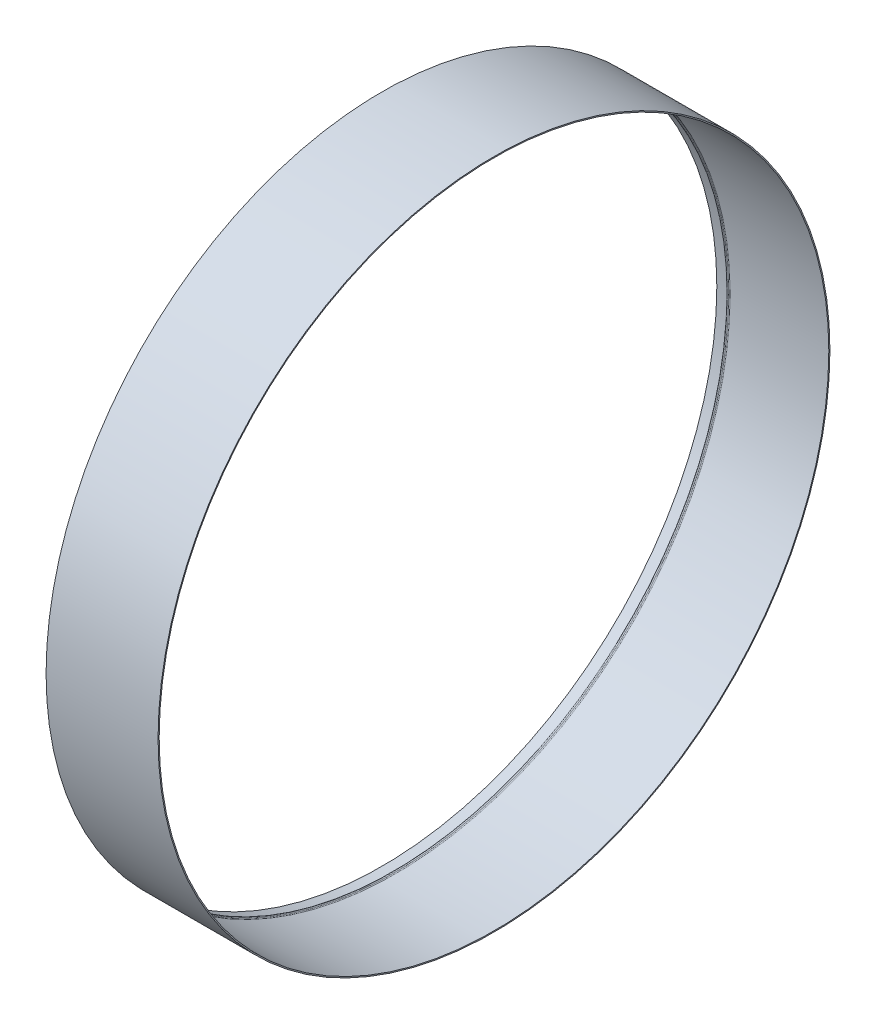
ISO-10303-21;
HEADER;
FILE_DESCRIPTION(('STEP AP214'),'2;1');
FILE_NAME('part.step','',(''),(''),'','','');
FILE_SCHEMA(('AUTOMOTIVE_DESIGN { 1 0 10303 214 1 1 1 1 }'));
ENDSEC;
DATA;
#1=APPLICATION_CONTEXT('core data for automotive mechanical design processes');
#2=APPLICATION_PROTOCOL_DEFINITION('international standard','automotive_design',2000,#1);
#3=PRODUCT_CONTEXT('',#1,'mechanical');
#4=PRODUCT('Part','Part','',(#3));
#5=PRODUCT_RELATED_PRODUCT_CATEGORY('part','',(#4));
#6=PRODUCT_DEFINITION_FORMATION('','',#4);
#7=PRODUCT_DEFINITION_CONTEXT('part definition',#1,'design');
#8=PRODUCT_DEFINITION('design','',#6,#7);
#9=PRODUCT_DEFINITION_SHAPE('','',#8);
#10=(LENGTH_UNIT() NAMED_UNIT(*) SI_UNIT(.MILLI.,.METRE.));
#11=(NAMED_UNIT(*) PLANE_ANGLE_UNIT() SI_UNIT($,.RADIAN.));
#12=(NAMED_UNIT(*) SI_UNIT($,.STERADIAN.) SOLID_ANGLE_UNIT());
#13=UNCERTAINTY_MEASURE_WITH_UNIT(LENGTH_MEASURE(1.E-05),#10,'distance_accuracy_value','');
#14=(GEOMETRIC_REPRESENTATION_CONTEXT(3) GLOBAL_UNCERTAINTY_ASSIGNED_CONTEXT((#13)) GLOBAL_UNIT_ASSIGNED_CONTEXT((#10,
#11,#12)) REPRESENTATION_CONTEXT('',''));
#15=CARTESIAN_POINT('',(0.,0.,0.));
#16=DIRECTION('',(0.,0.,1.));
#17=DIRECTION('',(1.,0.,0.));
#18=AXIS2_PLACEMENT_3D('',#15,#16,#17);
#19=CARTESIAN_POINT('',(-450.,0.,0.));
#20=DIRECTION('',(1.,0.,0.));
#21=DIRECTION('',(0.,0.,-1.));
#22=AXIS2_PLACEMENT_3D('',#19,#20,#21);
#23=CYLINDRICAL_SURFACE('',#22,1495.);
#24=CARTESIAN_POINT('',(-450.,0.,0.));
#25=DIRECTION('',(1.,0.,0.));
#26=DIRECTION('',(0.,0.,-1.));
#27=AXIS2_PLACEMENT_3D('',#24,#25,#26);
#28=CIRCLE('',#27,1495.);
#29=CARTESIAN_POINT('',(-450.,0.,-1495.));
#30=VERTEX_POINT('',#29);
#31=EDGE_CURVE('E76',#30,#30,#28,.T.);
#32=ORIENTED_EDGE('',*,*,#31,.T.);
#33=EDGE_LOOP('',(#32));
#34=FACE_BOUND('',#33,.T.);
#35=CARTESIAN_POINT('',(-500.,0.,0.));
#36=DIRECTION('',(1.,0.,0.));
#37=DIRECTION('',(0.,0.,-1.));
#38=AXIS2_PLACEMENT_3D('',#35,#36,#37);
#39=CIRCLE('',#38,1495.);
#40=CARTESIAN_POINT('',(-500.,0.,-1495.));
#41=VERTEX_POINT('',#40);
#42=EDGE_CURVE('E11',#41,#41,#39,.T.);
#43=ORIENTED_EDGE('',*,*,#42,.F.);
#44=EDGE_LOOP('',(#43));
#45=FACE_BOUND('',#44,.T.);
#46=ADVANCED_FACE('F16',(#34,#45),#23,.F.);
#47=CARTESIAN_POINT('',(-500.,0.,0.));
#48=DIRECTION('',(-1.,0.,0.));
#49=DIRECTION('',(0.,0.,1.));
#50=AXIS2_PLACEMENT_3D('',#47,#48,#49);
#51=PLANE('',#50);
#52=ORIENTED_EDGE('',*,*,#42,.T.);
#53=EDGE_LOOP('',(#52));
#54=FACE_BOUND('',#53,.T.);
#55=CARTESIAN_POINT('',(-500.,0.,0.));
#56=DIRECTION('',(1.,0.,0.));
#57=DIRECTION('',(0.,0.,-1.));
#58=AXIS2_PLACEMENT_3D('',#55,#56,#57);
#59=CIRCLE('',#58,1500.);
#60=CARTESIAN_POINT('',(-500.,0.,-1500.));
#61=VERTEX_POINT('',#60);
#62=EDGE_CURVE('E27',#61,#61,#59,.T.);
#63=ORIENTED_EDGE('',*,*,#62,.F.);
#64=EDGE_LOOP('',(#63));
#65=FACE_BOUND('',#64,.T.);
#66=ADVANCED_FACE('F18',(#54,#65),#51,.T.);
#67=CARTESIAN_POINT('',(-500.,0.,0.));
#68=DIRECTION('',(1.,0.,0.));
#69=DIRECTION('',(0.,0.,-1.));
#70=AXIS2_PLACEMENT_3D('',#67,#68,#69);
#71=CYLINDRICAL_SURFACE('',#70,1500.);
#72=CARTESIAN_POINT('',(2.74627044708794E-13,0.,0.));
#73=DIRECTION('',(1.,0.,0.));
#74=DIRECTION('',(0.,0.,-1.));
#75=AXIS2_PLACEMENT_3D('',#72,#73,#74);
#76=CIRCLE('',#75,1500.);
#77=CARTESIAN_POINT('',(2.75239368108368E-13,0.,-1500.));
#78=VERTEX_POINT('',#77);
#79=EDGE_CURVE('E85',#78,#78,#76,.T.);
#80=ORIENTED_EDGE('',*,*,#79,.F.);
#81=EDGE_LOOP('',(#80));
#82=FACE_BOUND('',#81,.T.);
#83=ORIENTED_EDGE('',*,*,#62,.T.);
#84=EDGE_LOOP('',(#83));
#85=FACE_BOUND('',#84,.T.);
#86=ADVANCED_FACE('F129',(#82,#85),#71,.T.);
#87=CARTESIAN_POINT('',(2.74627044708794E-13,0.,0.));
#88=DIRECTION('',(1.,0.,0.));
#89=DIRECTION('',(0.,1.,0.));
#90=AXIS2_PLACEMENT_3D('',#87,#88,#89);
#91=PLANE('',#90);
#92=CARTESIAN_POINT('',(2.74627044708794E-13,0.,0.));
#93=DIRECTION('',(1.,0.,0.));
#94=DIRECTION('',(0.,0.,-1.));
#95=AXIS2_PLACEMENT_3D('',#92,#93,#94);
#96=CIRCLE('',#95,1495.);
#97=CARTESIAN_POINT('',(2.74627044708794E-13,0.,-1495.));
#98=VERTEX_POINT('',#97);
#99=EDGE_CURVE('E89',#98,#98,#96,.T.);
#100=ORIENTED_EDGE('',*,*,#99,.F.);
#101=EDGE_LOOP('',(#100));
#102=FACE_BOUND('',#101,.T.);
#103=ORIENTED_EDGE('',*,*,#79,.T.);
#104=EDGE_LOOP('',(#103));
#105=FACE_BOUND('',#104,.T.);
#106=ADVANCED_FACE('F119',(#102,#105),#91,.T.);
#107=CARTESIAN_POINT('',(2.74627044708794E-13,0.,0.));
#108=DIRECTION('',(1.,0.,0.));
#109=DIRECTION('',(0.,0.,-1.));
#110=AXIS2_PLACEMENT_3D('',#107,#108,#109);
#111=CYLINDRICAL_SURFACE('',#110,1495.);
#112=ORIENTED_EDGE('',*,*,#99,.T.);
#113=EDGE_LOOP('',(#112));
#114=FACE_BOUND('',#113,.T.);
#115=CARTESIAN_POINT('',(-440.339745962155,0.,0.));
#116=DIRECTION('',(1.,0.,0.));
#117=DIRECTION('',(0.,0.,-1.));
#118=AXIS2_PLACEMENT_3D('',#115,#116,#117);
#119=CIRCLE('',#118,1495.);
#120=CARTESIAN_POINT('',(-440.339745962155,0.,-1495.));
#121=VERTEX_POINT('',#120);
#122=EDGE_CURVE('E94',#121,#121,#119,.T.);
#123=ORIENTED_EDGE('',*,*,#122,.F.);
#124=EDGE_LOOP('',(#123));
#125=FACE_BOUND('',#124,.T.);
#126=ADVANCED_FACE('F110',(#114,#125),#111,.F.);
#127=CARTESIAN_POINT('',(-440.339745962155,0.,0.));
#128=DIRECTION('',(1.,0.,0.));
#129=DIRECTION('',(0.,0.,-1.));
#130=AXIS2_PLACEMENT_3D('',#127,#128,#129);
#131=TOROIDAL_SURFACE('',#130,1490.,5.);
#132=ORIENTED_EDGE('',*,*,#122,.T.);
#133=EDGE_LOOP('',(#132));
#134=FACE_BOUND('',#133,.T.);
#135=CARTESIAN_POINT('',(-444.669872981078,0.,0.));
#136=DIRECTION('',(1.,0.,0.));
#137=DIRECTION('',(0.,0.,-1.));
#138=AXIS2_PLACEMENT_3D('',#135,#136,#137);
#139=CIRCLE('',#138,1492.5);
#140=CARTESIAN_POINT('',(-444.669872981078,0.,-1492.5));
#141=VERTEX_POINT('',#140);
#142=EDGE_CURVE('E20',#141,#141,#139,.T.);
#143=ORIENTED_EDGE('',*,*,#142,.F.);
#144=EDGE_LOOP('',(#143));
#145=FACE_BOUND('',#144,.T.);
#146=ADVANCED_FACE('F108',(#134,#145),#131,.F.);
#147=CARTESIAN_POINT('',(-449.,0.,0.));
#148=DIRECTION('',(1.,0.,0.));
#149=DIRECTION('',(0.,0.,-1.));
#150=AXIS2_PLACEMENT_3D('',#147,#148,#149);
#151=TOROIDAL_SURFACE('',#150,1495.,5.);
#152=ORIENTED_EDGE('',*,*,#142,.T.);
#153=EDGE_LOOP('',(#152));
#154=FACE_BOUND('',#153,.T.);
#155=CARTESIAN_POINT('',(-449.,0.,0.));
#156=DIRECTION('',(1.,0.,0.));
#157=DIRECTION('',(0.,0.,-1.));
#158=AXIS2_PLACEMENT_3D('',#155,#156,#157);
#159=CIRCLE('',#158,1490.);
#160=CARTESIAN_POINT('',(-449.,0.,-1490.));
#161=VERTEX_POINT('',#160);
#162=EDGE_CURVE('E65',#161,#161,#159,.T.);
#163=ORIENTED_EDGE('',*,*,#162,.F.);
#164=EDGE_LOOP('',(#163));
#165=FACE_BOUND('',#164,.T.);
#166=ADVANCED_FACE('F105',(#154,#165),#151,.T.);
#167=CARTESIAN_POINT('',(-449.,0.,0.));
#168=DIRECTION('',(1.,0.,0.));
#169=DIRECTION('',(0.,0.,-1.));
#170=AXIS2_PLACEMENT_3D('',#167,#168,#169);
#171=CYLINDRICAL_SURFACE('',#170,1490.);
#172=ORIENTED_EDGE('',*,*,#162,.T.);
#173=EDGE_LOOP('',(#172));
#174=FACE_BOUND('',#173,.T.);
#175=CARTESIAN_POINT('',(-450.,0.,0.));
#176=DIRECTION('',(1.,0.,0.));
#177=DIRECTION('',(0.,0.,-1.));
#178=AXIS2_PLACEMENT_3D('',#175,#176,#177);
#179=CIRCLE('',#178,1490.);
#180=CARTESIAN_POINT('',(-450.,0.,-1490.));
#181=VERTEX_POINT('',#180);
#182=EDGE_CURVE('E71',#181,#181,#179,.T.);
#183=ORIENTED_EDGE('',*,*,#182,.F.);
#184=EDGE_LOOP('',(#183));
#185=FACE_BOUND('',#184,.T.);
#186=ADVANCED_FACE('F117',(#174,#185),#171,.F.);
#187=CARTESIAN_POINT('',(-450.,0.,0.));
#188=DIRECTION('',(-1.,0.,0.));
#189=DIRECTION('',(0.,0.,1.));
#190=AXIS2_PLACEMENT_3D('',#187,#188,#189);
#191=PLANE('',#190);
#192=ORIENTED_EDGE('',*,*,#182,.T.);
#193=EDGE_LOOP('',(#192));
#194=FACE_BOUND('',#193,.T.);
#195=ORIENTED_EDGE('',*,*,#31,.F.);
#196=EDGE_LOOP('',(#195));
#197=FACE_BOUND('',#196,.T.);
#198=ADVANCED_FACE('F72',(#194,#197),#191,.T.);
#199=CLOSED_SHELL('',(#46,#66,#86,#106,#126,#146,#166,#186,#198));
#200=MANIFOLD_SOLID_BREP('B1',#199);
#201=ADVANCED_BREP_SHAPE_REPRESENTATION('',(#18,#200),#14);
#202=SHAPE_DEFINITION_REPRESENTATION(#9,#201);
ENDSEC;
END-ISO-10303-21;
